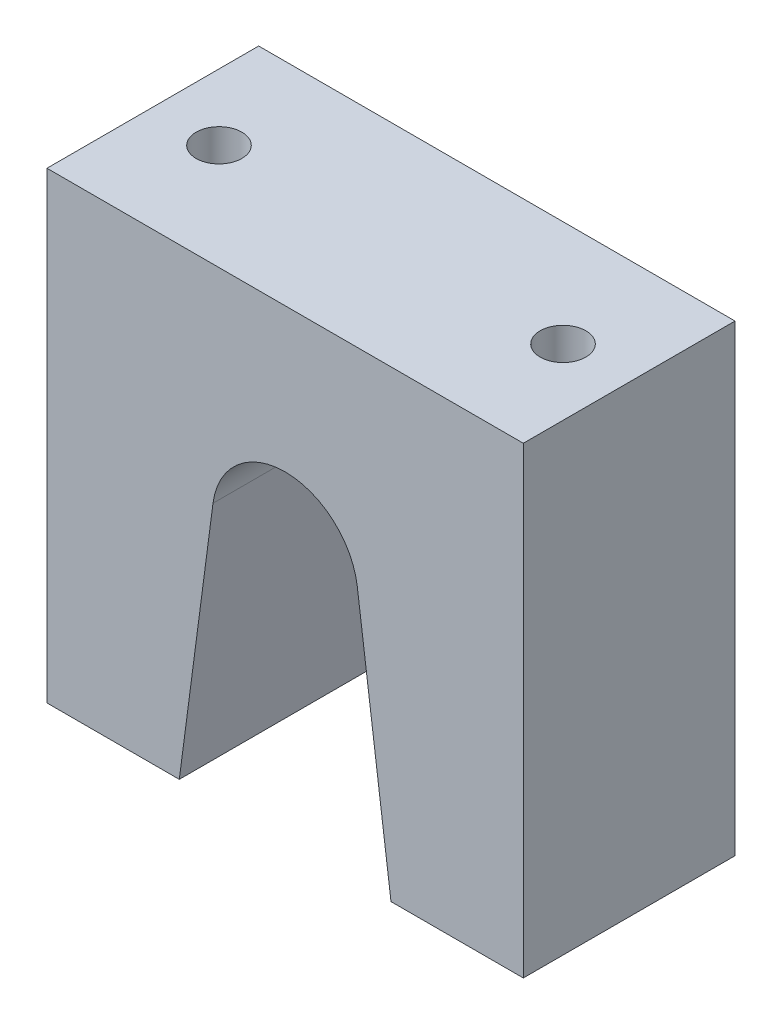
ISO-10303-21;
HEADER;
FILE_DESCRIPTION(('STEP AP214'),'2;1');
FILE_NAME('part.step','',(''),(''),'','','');
FILE_SCHEMA(('AUTOMOTIVE_DESIGN { 1 0 10303 214 1 1 1 1 }'));
ENDSEC;
DATA;
#1=APPLICATION_CONTEXT('core data for automotive mechanical design processes');
#2=APPLICATION_PROTOCOL_DEFINITION('international standard','automotive_design',2000,#1);
#3=PRODUCT_CONTEXT('',#1,'mechanical');
#4=PRODUCT('Part','Part','',(#3));
#5=PRODUCT_RELATED_PRODUCT_CATEGORY('part','',(#4));
#6=PRODUCT_DEFINITION_FORMATION('','',#4);
#7=PRODUCT_DEFINITION_CONTEXT('part definition',#1,'design');
#8=PRODUCT_DEFINITION('design','',#6,#7);
#9=PRODUCT_DEFINITION_SHAPE('','',#8);
#10=(LENGTH_UNIT() NAMED_UNIT(*) SI_UNIT(.MILLI.,.METRE.));
#11=(NAMED_UNIT(*) PLANE_ANGLE_UNIT() SI_UNIT($,.RADIAN.));
#12=(NAMED_UNIT(*) SI_UNIT($,.STERADIAN.) SOLID_ANGLE_UNIT());
#13=UNCERTAINTY_MEASURE_WITH_UNIT(LENGTH_MEASURE(1.E-05),#10,'distance_accuracy_value','');
#14=(GEOMETRIC_REPRESENTATION_CONTEXT(3) GLOBAL_UNCERTAINTY_ASSIGNED_CONTEXT((#13)) GLOBAL_UNIT_ASSIGNED_CONTEXT((#10,
#11,#12)) REPRESENTATION_CONTEXT('',''));
#15=CARTESIAN_POINT('',(0.,0.,0.));
#16=DIRECTION('',(0.,0.,1.));
#17=DIRECTION('',(1.,0.,0.));
#18=AXIS2_PLACEMENT_3D('',#15,#16,#17);
#19=CARTESIAN_POINT('',(18.,-18.628896236329,16.));
#20=DIRECTION('',(-1.,0.,0.));
#21=DIRECTION('',(0.,-1.,0.));
#22=AXIS2_PLACEMENT_3D('',#19,#20,#21);
#23=PLANE('',#22);
#24=DIRECTION('',(0.,1.,0.));
#25=VECTOR('',#24,1.);
#26=CARTESIAN_POINT('',(18.,-18.628896236329,0.));
#27=LINE('',#26,#25);
#28=CARTESIAN_POINT('',(18.,-18.628896236329,0.));
#29=VERTEX_POINT('',#28);
#30=CARTESIAN_POINT('',(18.,16.371103763671,0.));
#31=VERTEX_POINT('',#30);
#32=EDGE_CURVE('E159',#29,#31,#27,.T.);
#33=ORIENTED_EDGE('',*,*,#32,.T.);
#34=DIRECTION('',(0.,0.,-1.));
#35=VECTOR('',#34,1.);
#36=CARTESIAN_POINT('',(18.,16.371103763671,16.));
#37=LINE('',#36,#35);
#38=CARTESIAN_POINT('',(18.,16.371103763671,16.));
#39=VERTEX_POINT('',#38);
#40=EDGE_CURVE('E11',#39,#31,#37,.T.);
#41=ORIENTED_EDGE('',*,*,#40,.F.);
#42=DIRECTION('',(0.,1.,0.));
#43=VECTOR('',#42,1.);
#44=CARTESIAN_POINT('',(18.,-18.628896236329,16.));
#45=LINE('',#44,#43);
#46=CARTESIAN_POINT('',(18.,-18.628896236329,16.));
#47=VERTEX_POINT('',#46);
#48=EDGE_CURVE('E182',#47,#39,#45,.T.);
#49=ORIENTED_EDGE('',*,*,#48,.F.);
#50=DIRECTION('',(0.,0.,-1.));
#51=VECTOR('',#50,1.);
#52=CARTESIAN_POINT('',(18.,-18.628896236329,16.));
#53=LINE('',#52,#51);
#54=EDGE_CURVE('E155',#47,#29,#53,.T.);
#55=ORIENTED_EDGE('',*,*,#54,.T.);
#56=EDGE_LOOP('',(#33,#41,#49,#55));
#57=FACE_BOUND('',#56,.T.);
#58=ADVANCED_FACE('F53',(#57),#23,.F.);
#59=CARTESIAN_POINT('',(-18.,16.371103763671,16.));
#60=DIRECTION('',(0.,-1.,0.));
#61=DIRECTION('',(1.,0.,0.));
#62=AXIS2_PLACEMENT_3D('',#59,#60,#61);
#63=PLANE('',#62);
#64=CARTESIAN_POINT('',(-13.,16.371103763671,8.));
#65=DIRECTION('',(0.,1.,0.));
#66=DIRECTION('',(0.,0.,1.));
#67=AXIS2_PLACEMENT_3D('',#64,#65,#66);
#68=CIRCLE('',#67,1.7272);
#69=CARTESIAN_POINT('',(-13.,16.371103763671,9.7272));
#70=VERTEX_POINT('',#69);
#71=EDGE_CURVE('E241',#70,#70,#68,.T.);
#72=ORIENTED_EDGE('',*,*,#71,.F.);
#73=EDGE_LOOP('',(#72));
#74=FACE_BOUND('',#73,.T.);
#75=CARTESIAN_POINT('',(13.,16.371103763671,8.));
#76=DIRECTION('',(0.,1.,0.));
#77=DIRECTION('',(0.,0.,1.));
#78=AXIS2_PLACEMENT_3D('',#75,#76,#77);
#79=CIRCLE('',#78,1.7272);
#80=CARTESIAN_POINT('',(13.,16.371103763671,9.72719999999999));
#81=VERTEX_POINT('',#80);
#82=EDGE_CURVE('E233',#81,#81,#79,.T.);
#83=ORIENTED_EDGE('',*,*,#82,.F.);
#84=EDGE_LOOP('',(#83));
#85=FACE_BOUND('',#84,.T.);
#86=DIRECTION('',(-1.,0.,0.));
#87=VECTOR('',#86,1.);
#88=CARTESIAN_POINT('',(-18.,16.371103763671,0.));
#89=LINE('',#88,#87);
#90=CARTESIAN_POINT('',(-18.,16.371103763671,0.));
#91=VERTEX_POINT('',#90);
#92=EDGE_CURVE('E163',#31,#91,#89,.T.);
#93=ORIENTED_EDGE('',*,*,#92,.T.);
#94=DIRECTION('',(0.,0.,-1.));
#95=VECTOR('',#94,1.);
#96=CARTESIAN_POINT('',(-18.,16.371103763671,16.));
#97=LINE('',#96,#95);
#98=CARTESIAN_POINT('',(-18.,16.371103763671,16.));
#99=VERTEX_POINT('',#98);
#100=EDGE_CURVE('E62',#99,#91,#97,.T.);
#101=ORIENTED_EDGE('',*,*,#100,.F.);
#102=DIRECTION('',(-1.,0.,0.));
#103=VECTOR('',#102,1.);
#104=CARTESIAN_POINT('',(-18.,16.371103763671,16.));
#105=LINE('',#104,#103);
#106=EDGE_CURVE('E114',#39,#99,#105,.T.);
#107=ORIENTED_EDGE('',*,*,#106,.F.);
#108=ORIENTED_EDGE('',*,*,#40,.T.);
#109=EDGE_LOOP('',(#93,#101,#107,#108));
#110=FACE_BOUND('',#109,.T.);
#111=ADVANCED_FACE('F250',(#74,#85,#110),#63,.F.);
#112=CARTESIAN_POINT('',(-18.,-18.628896236329,16.));
#113=DIRECTION('',(1.,0.,0.));
#114=DIRECTION('',(0.,0.,-1.));
#115=AXIS2_PLACEMENT_3D('',#112,#113,#114);
#116=PLANE('',#115);
#117=DIRECTION('',(0.,-1.,0.));
#118=VECTOR('',#117,1.);
#119=CARTESIAN_POINT('',(-18.,-18.628896236329,0.));
#120=LINE('',#119,#118);
#121=CARTESIAN_POINT('',(-18.,-18.628896236329,0.));
#122=VERTEX_POINT('',#121);
#123=EDGE_CURVE('E167',#91,#122,#120,.T.);
#124=ORIENTED_EDGE('',*,*,#123,.T.);
#125=DIRECTION('',(0.,0.,-1.));
#126=VECTOR('',#125,1.);
#127=CARTESIAN_POINT('',(-18.,-18.628896236329,16.));
#128=LINE('',#127,#126);
#129=CARTESIAN_POINT('',(-18.,-18.628896236329,16.));
#130=VERTEX_POINT('',#129);
#131=EDGE_CURVE('E193',#130,#122,#128,.T.);
#132=ORIENTED_EDGE('',*,*,#131,.F.);
#133=DIRECTION('',(0.,-1.,0.));
#134=VECTOR('',#133,1.);
#135=CARTESIAN_POINT('',(-18.,-18.628896236329,16.));
#136=LINE('',#135,#134);
#137=EDGE_CURVE('E205',#99,#130,#136,.T.);
#138=ORIENTED_EDGE('',*,*,#137,.F.);
#139=ORIENTED_EDGE('',*,*,#100,.T.);
#140=EDGE_LOOP('',(#124,#132,#138,#139));
#141=FACE_BOUND('',#140,.T.);
#142=ADVANCED_FACE('F203',(#141),#116,.F.);
#143=CARTESIAN_POINT('',(-8.,-18.628896236329,16.));
#144=DIRECTION('',(0.,1.,0.));
#145=DIRECTION('',(-1.,0.,0.));
#146=AXIS2_PLACEMENT_3D('',#143,#144,#145);
#147=PLANE('',#146);
#148=DIRECTION('',(1.,0.,0.));
#149=VECTOR('',#148,1.);
#150=CARTESIAN_POINT('',(-8.,-18.628896236329,0.));
#151=LINE('',#150,#149);
#152=CARTESIAN_POINT('',(-8.,-18.628896236329,0.));
#153=VERTEX_POINT('',#152);
#154=EDGE_CURVE('E170',#122,#153,#151,.T.);
#155=ORIENTED_EDGE('',*,*,#154,.T.);
#156=DIRECTION('',(0.,0.,-1.));
#157=VECTOR('',#156,1.);
#158=CARTESIAN_POINT('',(-8.,-18.628896236329,16.));
#159=LINE('',#158,#157);
#160=CARTESIAN_POINT('',(-8.,-18.628896236329,16.));
#161=VERTEX_POINT('',#160);
#162=EDGE_CURVE('E189',#161,#153,#159,.T.);
#163=ORIENTED_EDGE('',*,*,#162,.F.);
#164=DIRECTION('',(1.,0.,0.));
#165=VECTOR('',#164,1.);
#166=CARTESIAN_POINT('',(-8.,-18.628896236329,16.));
#167=LINE('',#166,#165);
#168=EDGE_CURVE('E218',#130,#161,#167,.T.);
#169=ORIENTED_EDGE('',*,*,#168,.F.);
#170=ORIENTED_EDGE('',*,*,#131,.T.);
#171=EDGE_LOOP('',(#155,#163,#169,#170));
#172=FACE_BOUND('',#171,.T.);
#173=ADVANCED_FACE('F213',(#172),#147,.F.);
#174=CARTESIAN_POINT('',(-5.45294673755596,0.717894057210285,16.));
#175=DIRECTION('',(-0.99144486137381,0.130526192220052,0.));
#176=DIRECTION('',(-0.130526192220052,-0.99144486137381,0.));
#177=AXIS2_PLACEMENT_3D('',#174,#175,#176);
#178=PLANE('',#177);
#179=DIRECTION('',(0.130526192220052,0.99144486137381,0.));
#180=VECTOR('',#179,1.);
#181=CARTESIAN_POINT('',(-5.45294673755596,0.717894057210285,0.));
#182=LINE('',#181,#180);
#183=CARTESIAN_POINT('',(-5.45294673755596,0.717894057210286,0.));
#184=VERTEX_POINT('',#183);
#185=EDGE_CURVE('E173',#153,#184,#182,.T.);
#186=ORIENTED_EDGE('',*,*,#185,.T.);
#187=DIRECTION('',(0.,0.,-1.));
#188=VECTOR('',#187,1.);
#189=CARTESIAN_POINT('',(-5.45294673755596,0.717894057210286,16.));
#190=LINE('',#189,#188);
#191=CARTESIAN_POINT('',(-5.45294673755596,0.717894057210286,16.));
#192=VERTEX_POINT('',#191);
#193=EDGE_CURVE('E146',#192,#184,#190,.T.);
#194=ORIENTED_EDGE('',*,*,#193,.F.);
#195=DIRECTION('',(0.130526192220052,0.99144486137381,0.));
#196=VECTOR('',#195,1.);
#197=CARTESIAN_POINT('',(-5.45294673755596,0.717894057210285,16.));
#198=LINE('',#197,#196);
#199=EDGE_CURVE('E135',#161,#192,#198,.T.);
#200=ORIENTED_EDGE('',*,*,#199,.F.);
#201=ORIENTED_EDGE('',*,*,#162,.T.);
#202=EDGE_LOOP('',(#186,#194,#200,#201));
#203=FACE_BOUND('',#202,.T.);
#204=ADVANCED_FACE('F216',(#203),#178,.F.);
#205=CARTESIAN_POINT('',(0.,0.,16.));
#206=DIRECTION('',(0.,0.,-1.));
#207=DIRECTION('',(-1.,0.,0.));
#208=AXIS2_PLACEMENT_3D('',#205,#206,#207);
#209=CYLINDRICAL_SURFACE('',#208,5.5);
#210=CARTESIAN_POINT('',(0.,0.,0.));
#211=DIRECTION('',(0.,0.,-1.));
#212=DIRECTION('',(1.,0.,0.));
#213=AXIS2_PLACEMENT_3D('',#210,#211,#212);
#214=CIRCLE('',#213,5.5);
#215=CARTESIAN_POINT('',(5.45294673755596,0.717894057210286,0.));
#216=VERTEX_POINT('',#215);
#217=EDGE_CURVE('E144',#184,#216,#214,.T.);
#218=ORIENTED_EDGE('',*,*,#217,.T.);
#219=DIRECTION('',(0.,0.,-1.));
#220=VECTOR('',#219,1.);
#221=CARTESIAN_POINT('',(5.45294673755596,0.717894057210286,16.));
#222=LINE('',#221,#220);
#223=CARTESIAN_POINT('',(5.45294673755596,0.717894057210286,16.));
#224=VERTEX_POINT('',#223);
#225=EDGE_CURVE('E141',#224,#216,#222,.T.);
#226=ORIENTED_EDGE('',*,*,#225,.F.);
#227=CARTESIAN_POINT('',(0.,0.,16.));
#228=DIRECTION('',(0.,0.,-1.));
#229=DIRECTION('',(1.,0.,0.));
#230=AXIS2_PLACEMENT_3D('',#227,#228,#229);
#231=CIRCLE('',#230,5.5);
#232=EDGE_CURVE('E129',#192,#224,#231,.T.);
#233=ORIENTED_EDGE('',*,*,#232,.F.);
#234=ORIENTED_EDGE('',*,*,#193,.T.);
#235=EDGE_LOOP('',(#218,#226,#233,#234));
#236=FACE_BOUND('',#235,.T.);
#237=ADVANCED_FACE('F142',(#236),#209,.F.);
#238=CARTESIAN_POINT('',(5.45294673755596,0.717894057210286,16.));
#239=DIRECTION('',(0.99144486137381,0.130526192220052,0.));
#240=DIRECTION('',(-0.130526192220052,0.99144486137381,0.));
#241=AXIS2_PLACEMENT_3D('',#238,#239,#240);
#242=PLANE('',#241);
#243=DIRECTION('',(0.130526192220052,-0.99144486137381,0.));
#244=VECTOR('',#243,1.);
#245=CARTESIAN_POINT('',(5.45294673755596,0.717894057210286,0.));
#246=LINE('',#245,#244);
#247=CARTESIAN_POINT('',(8.,-18.628896236329,0.));
#248=VERTEX_POINT('',#247);
#249=EDGE_CURVE('E100',#216,#248,#246,.T.);
#250=ORIENTED_EDGE('',*,*,#249,.T.);
#251=DIRECTION('',(0.,0.,-1.));
#252=VECTOR('',#251,1.);
#253=CARTESIAN_POINT('',(8.,-18.628896236329,16.));
#254=LINE('',#253,#252);
#255=CARTESIAN_POINT('',(8.,-18.628896236329,16.));
#256=VERTEX_POINT('',#255);
#257=EDGE_CURVE('E147',#256,#248,#254,.T.);
#258=ORIENTED_EDGE('',*,*,#257,.F.);
#259=DIRECTION('',(0.130526192220052,-0.99144486137381,0.));
#260=VECTOR('',#259,1.);
#261=CARTESIAN_POINT('',(5.45294673755596,0.717894057210286,16.));
#262=LINE('',#261,#260);
#263=EDGE_CURVE('E133',#224,#256,#262,.T.);
#264=ORIENTED_EDGE('',*,*,#263,.F.);
#265=ORIENTED_EDGE('',*,*,#225,.T.);
#266=EDGE_LOOP('',(#250,#258,#264,#265));
#267=FACE_BOUND('',#266,.T.);
#268=ADVANCED_FACE('F149',(#267),#242,.F.);
#269=CARTESIAN_POINT('',(8.,-18.628896236329,16.));
#270=DIRECTION('',(0.,1.,0.));
#271=DIRECTION('',(-1.,0.,0.));
#272=AXIS2_PLACEMENT_3D('',#269,#270,#271);
#273=PLANE('',#272);
#274=DIRECTION('',(1.,0.,0.));
#275=VECTOR('',#274,1.);
#276=CARTESIAN_POINT('',(8.,-18.628896236329,0.));
#277=LINE('',#276,#275);
#278=EDGE_CURVE('E106',#248,#29,#277,.T.);
#279=ORIENTED_EDGE('',*,*,#278,.T.);
#280=ORIENTED_EDGE('',*,*,#54,.F.);
#281=DIRECTION('',(1.,0.,0.));
#282=VECTOR('',#281,1.);
#283=CARTESIAN_POINT('',(8.,-18.628896236329,16.));
#284=LINE('',#283,#282);
#285=EDGE_CURVE('E70',#256,#47,#284,.T.);
#286=ORIENTED_EDGE('',*,*,#285,.F.);
#287=ORIENTED_EDGE('',*,*,#257,.T.);
#288=EDGE_LOOP('',(#279,#280,#286,#287));
#289=FACE_BOUND('',#288,.T.);
#290=ADVANCED_FACE('F257',(#289),#273,.F.);
#291=CARTESIAN_POINT('',(0.,0.,16.));
#292=DIRECTION('',(0.,0.,1.));
#293=DIRECTION('',(1.,0.,0.));
#294=AXIS2_PLACEMENT_3D('',#291,#292,#293);
#295=PLANE('',#294);
#296=ORIENTED_EDGE('',*,*,#48,.T.);
#297=ORIENTED_EDGE('',*,*,#106,.T.);
#298=ORIENTED_EDGE('',*,*,#137,.T.);
#299=ORIENTED_EDGE('',*,*,#168,.T.);
#300=ORIENTED_EDGE('',*,*,#199,.T.);
#301=ORIENTED_EDGE('',*,*,#232,.T.);
#302=ORIENTED_EDGE('',*,*,#263,.T.);
#303=ORIENTED_EDGE('',*,*,#285,.T.);
#304=EDGE_LOOP('',(#296,#297,#298,#299,#300,#301,#302,#303));
#305=FACE_BOUND('',#304,.T.);
#306=ADVANCED_FACE('F131',(#305),#295,.T.);
#307=CARTESIAN_POINT('',(0.,0.,0.));
#308=DIRECTION('',(0.,0.,1.));
#309=DIRECTION('',(1.,0.,0.));
#310=AXIS2_PLACEMENT_3D('',#307,#308,#309);
#311=PLANE('',#310);
#312=ORIENTED_EDGE('',*,*,#32,.F.);
#313=ORIENTED_EDGE('',*,*,#278,.F.);
#314=ORIENTED_EDGE('',*,*,#249,.F.);
#315=ORIENTED_EDGE('',*,*,#217,.F.);
#316=ORIENTED_EDGE('',*,*,#185,.F.);
#317=ORIENTED_EDGE('',*,*,#154,.F.);
#318=ORIENTED_EDGE('',*,*,#123,.F.);
#319=ORIENTED_EDGE('',*,*,#92,.F.);
#320=EDGE_LOOP('',(#312,#313,#314,#315,#316,#317,#318,#319));
#321=FACE_BOUND('',#320,.T.);
#322=ADVANCED_FACE('F209',(#321),#311,.F.);
#323=CARTESIAN_POINT('',(13.,-8.62889623632902,8.));
#324=DIRECTION('',(0.,1.,0.));
#325=DIRECTION('',(0.,0.,1.));
#326=AXIS2_PLACEMENT_3D('',#323,#324,#325);
#327=CONICAL_SURFACE('',#326,1.72719999999999,1.02974425867665);
#328=CARTESIAN_POINT('',(13.,-9.66670269751343,8.));
#329=VERTEX_POINT('',#328);
#330=VERTEX_LOOP('',#329);
#331=FACE_BOUND('',#330,.T.);
#332=CARTESIAN_POINT('',(13.,-8.62889623632902,8.));
#333=DIRECTION('',(0.,1.,0.));
#334=DIRECTION('',(0.,0.,1.));
#335=AXIS2_PLACEMENT_3D('',#332,#333,#334);
#336=CIRCLE('',#335,1.72719999999999);
#337=CARTESIAN_POINT('',(13.,-8.62889623632902,9.72719999999999));
#338=VERTEX_POINT('',#337);
#339=EDGE_CURVE('E164',#338,#338,#336,.T.);
#340=ORIENTED_EDGE('',*,*,#339,.T.);
#341=EDGE_LOOP('',(#340));
#342=FACE_BOUND('',#341,.T.);
#343=ADVANCED_FACE('F324',(#331,#342),#327,.F.);
#344=CARTESIAN_POINT('',(13.,16.371103763671,8.));
#345=DIRECTION('',(0.,1.,0.));
#346=DIRECTION('',(0.,0.,1.));
#347=AXIS2_PLACEMENT_3D('',#344,#345,#346);
#348=CYLINDRICAL_SURFACE('',#347,1.7272);
#349=ORIENTED_EDGE('',*,*,#339,.F.);
#350=EDGE_LOOP('',(#349));
#351=FACE_BOUND('',#350,.T.);
#352=ORIENTED_EDGE('',*,*,#82,.T.);
#353=EDGE_LOOP('',(#352));
#354=FACE_BOUND('',#353,.T.);
#355=ADVANCED_FACE('F333',(#351,#354),#348,.F.);
#356=CARTESIAN_POINT('',(-13.,-8.62889623632903,8.));
#357=DIRECTION('',(0.,1.,0.));
#358=DIRECTION('',(0.,0.,1.));
#359=AXIS2_PLACEMENT_3D('',#356,#357,#358);
#360=CONICAL_SURFACE('',#359,1.72719999999999,1.02974425867665);
#361=CARTESIAN_POINT('',(-13.,-9.66670269751343,8.));
#362=VERTEX_POINT('',#361);
#363=VERTEX_LOOP('',#362);
#364=FACE_BOUND('',#363,.T.);
#365=CARTESIAN_POINT('',(-13.,-8.62889623632903,8.));
#366=DIRECTION('',(0.,1.,0.));
#367=DIRECTION('',(0.,0.,1.));
#368=AXIS2_PLACEMENT_3D('',#365,#366,#367);
#369=CIRCLE('',#368,1.72719999999999);
#370=CARTESIAN_POINT('',(-13.,-8.62889623632903,9.72719999999999));
#371=VERTEX_POINT('',#370);
#372=EDGE_CURVE('E237',#371,#371,#369,.T.);
#373=ORIENTED_EDGE('',*,*,#372,.T.);
#374=EDGE_LOOP('',(#373));
#375=FACE_BOUND('',#374,.T.);
#376=ADVANCED_FACE('F344',(#364,#375),#360,.F.);
#377=CARTESIAN_POINT('',(-13.,16.371103763671,8.));
#378=DIRECTION('',(0.,1.,0.));
#379=DIRECTION('',(0.,0.,1.));
#380=AXIS2_PLACEMENT_3D('',#377,#378,#379);
#381=CYLINDRICAL_SURFACE('',#380,1.7272);
#382=ORIENTED_EDGE('',*,*,#372,.F.);
#383=EDGE_LOOP('',(#382));
#384=FACE_BOUND('',#383,.T.);
#385=ORIENTED_EDGE('',*,*,#71,.T.);
#386=EDGE_LOOP('',(#385));
#387=FACE_BOUND('',#386,.T.);
#388=ADVANCED_FACE('F248',(#384,#387),#381,.F.);
#389=CLOSED_SHELL('',(#58,#111,#142,#173,#204,#237,#268,#290,#306,#322,#343,#355,#376,#388));
#390=MANIFOLD_SOLID_BREP('B2',#389);
#391=ADVANCED_BREP_SHAPE_REPRESENTATION('',(#18,#390),#14);
#392=SHAPE_DEFINITION_REPRESENTATION(#9,#391);
ENDSEC;
END-ISO-10303-21;
